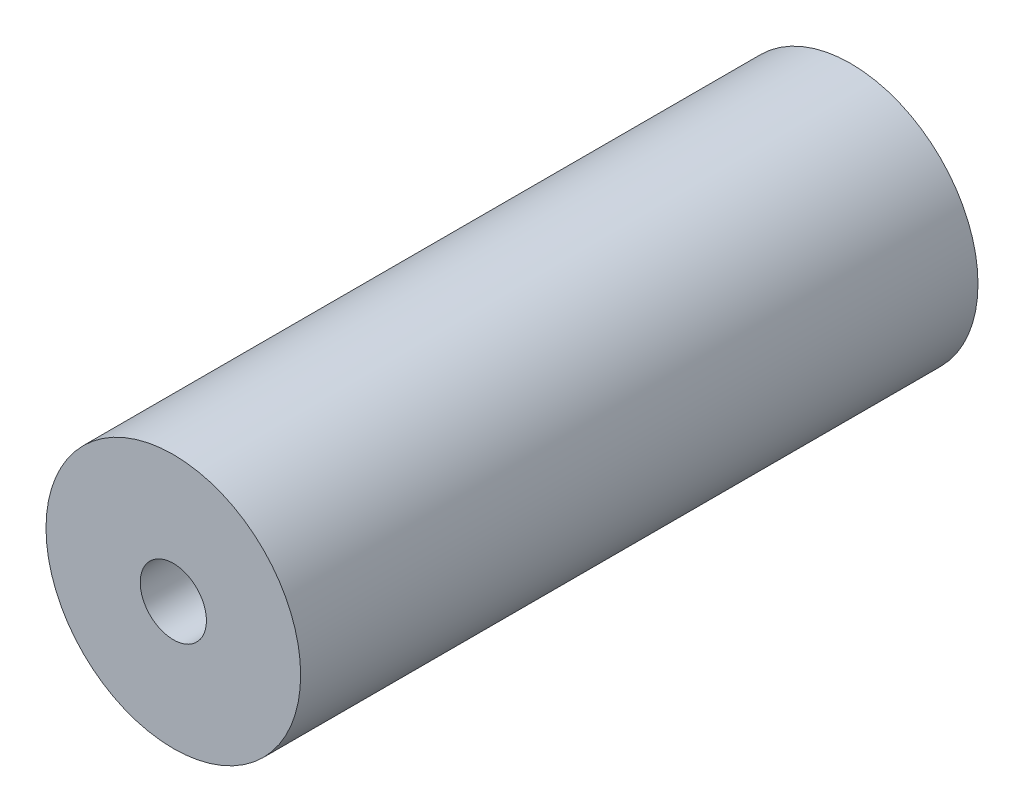
ISO-10303-21;
HEADER;
FILE_DESCRIPTION(('STEP AP214'),'2;1');
FILE_NAME('part.step','',(''),(''),'','','');
FILE_SCHEMA(('AUTOMOTIVE_DESIGN { 1 0 10303 214 1 1 1 1 }'));
ENDSEC;
DATA;
#1=APPLICATION_CONTEXT('core data for automotive mechanical design processes');
#2=APPLICATION_PROTOCOL_DEFINITION('international standard','automotive_design',2000,#1);
#3=PRODUCT_CONTEXT('',#1,'mechanical');
#4=PRODUCT('Part','Part','',(#3));
#5=PRODUCT_RELATED_PRODUCT_CATEGORY('part','',(#4));
#6=PRODUCT_DEFINITION_FORMATION('','',#4);
#7=PRODUCT_DEFINITION_CONTEXT('part definition',#1,'design');
#8=PRODUCT_DEFINITION('design','',#6,#7);
#9=PRODUCT_DEFINITION_SHAPE('','',#8);
#10=(LENGTH_UNIT() NAMED_UNIT(*) SI_UNIT(.MILLI.,.METRE.));
#11=(NAMED_UNIT(*) PLANE_ANGLE_UNIT() SI_UNIT($,.RADIAN.));
#12=(NAMED_UNIT(*) SI_UNIT($,.STERADIAN.) SOLID_ANGLE_UNIT());
#13=UNCERTAINTY_MEASURE_WITH_UNIT(LENGTH_MEASURE(1.E-05),#10,'distance_accuracy_value','');
#14=(GEOMETRIC_REPRESENTATION_CONTEXT(3) GLOBAL_UNCERTAINTY_ASSIGNED_CONTEXT((#13)) GLOBAL_UNIT_ASSIGNED_CONTEXT((#10,
#11,#12)) REPRESENTATION_CONTEXT('',''));
#15=CARTESIAN_POINT('',(0.,0.,0.));
#16=DIRECTION('',(0.,0.,1.));
#17=DIRECTION('',(1.,0.,0.));
#18=AXIS2_PLACEMENT_3D('',#15,#16,#17);
#19=CARTESIAN_POINT('',(0.,0.,26.6));
#20=DIRECTION('',(0.,0.,1.));
#21=DIRECTION('',(1.,0.,0.));
#22=AXIS2_PLACEMENT_3D('',#19,#20,#21);
#23=PLANE('',#22);
#24=CARTESIAN_POINT('',(0.,0.,26.6));
#25=DIRECTION('',(0.,0.,1.));
#26=DIRECTION('',(1.,0.,0.));
#27=AXIS2_PLACEMENT_3D('',#24,#25,#26);
#28=CIRCLE('',#27,5.);
#29=CARTESIAN_POINT('',(5.,0.,26.6));
#30=VERTEX_POINT('',#29);
#31=EDGE_CURVE('E10',#30,#30,#28,.T.);
#32=ORIENTED_EDGE('',*,*,#31,.T.);
#33=EDGE_LOOP('',(#32));
#34=FACE_BOUND('',#33,.T.);
#35=CARTESIAN_POINT('',(0.,0.,26.6));
#36=DIRECTION('',(0.,0.,1.));
#37=DIRECTION('',(1.,0.,0.));
#38=AXIS2_PLACEMENT_3D('',#35,#36,#37);
#39=CIRCLE('',#38,1.3);
#40=CARTESIAN_POINT('',(1.3,0.,26.6));
#41=VERTEX_POINT('',#40);
#42=EDGE_CURVE('E44',#41,#41,#39,.T.);
#43=ORIENTED_EDGE('',*,*,#42,.F.);
#44=EDGE_LOOP('',(#43));
#45=FACE_BOUND('',#44,.T.);
#46=ADVANCED_FACE('F33',(#34,#45),#23,.T.);
#47=CARTESIAN_POINT('',(0.,0.,0.));
#48=DIRECTION('',(0.,0.,1.));
#49=DIRECTION('',(1.,0.,0.));
#50=AXIS2_PLACEMENT_3D('',#47,#48,#49);
#51=PLANE('',#50);
#52=CARTESIAN_POINT('',(0.,0.,0.));
#53=DIRECTION('',(0.,0.,1.));
#54=DIRECTION('',(1.,0.,0.));
#55=AXIS2_PLACEMENT_3D('',#52,#53,#54);
#56=CIRCLE('',#55,5.);
#57=CARTESIAN_POINT('',(5.,0.,0.));
#58=VERTEX_POINT('',#57);
#59=EDGE_CURVE('E37',#58,#58,#56,.T.);
#60=ORIENTED_EDGE('',*,*,#59,.F.);
#61=EDGE_LOOP('',(#60));
#62=FACE_BOUND('',#61,.T.);
#63=CARTESIAN_POINT('',(0.,0.,0.));
#64=DIRECTION('',(0.,0.,1.));
#65=DIRECTION('',(1.,0.,0.));
#66=AXIS2_PLACEMENT_3D('',#63,#64,#65);
#67=CIRCLE('',#66,1.3);
#68=CARTESIAN_POINT('',(1.3,0.,0.));
#69=VERTEX_POINT('',#68);
#70=EDGE_CURVE('E46',#69,#69,#67,.T.);
#71=ORIENTED_EDGE('',*,*,#70,.T.);
#72=EDGE_LOOP('',(#71));
#73=FACE_BOUND('',#72,.T.);
#74=ADVANCED_FACE('F56',(#62,#73),#51,.F.);
#75=CARTESIAN_POINT('',(0.,0.,26.6));
#76=DIRECTION('',(0.,0.,-1.));
#77=DIRECTION('',(-1.,0.,0.));
#78=AXIS2_PLACEMENT_3D('',#75,#76,#77);
#79=CYLINDRICAL_SURFACE('',#78,5.);
#80=ORIENTED_EDGE('',*,*,#31,.F.);
#81=EDGE_LOOP('',(#80));
#82=FACE_BOUND('',#81,.T.);
#83=ORIENTED_EDGE('',*,*,#59,.T.);
#84=EDGE_LOOP('',(#83));
#85=FACE_BOUND('',#84,.T.);
#86=ADVANCED_FACE('F35',(#82,#85),#79,.T.);
#87=CARTESIAN_POINT('',(0.,0.,26.6));
#88=DIRECTION('',(0.,0.,-1.));
#89=DIRECTION('',(-1.,0.,0.));
#90=AXIS2_PLACEMENT_3D('',#87,#88,#89);
#91=CYLINDRICAL_SURFACE('',#90,1.3);
#92=ORIENTED_EDGE('',*,*,#42,.T.);
#93=EDGE_LOOP('',(#92));
#94=FACE_BOUND('',#93,.T.);
#95=ORIENTED_EDGE('',*,*,#70,.F.);
#96=EDGE_LOOP('',(#95));
#97=FACE_BOUND('',#96,.T.);
#98=ADVANCED_FACE('F52',(#94,#97),#91,.F.);
#99=CLOSED_SHELL('',(#46,#74,#86,#98));
#100=MANIFOLD_SOLID_BREP('B2',#99);
#101=ADVANCED_BREP_SHAPE_REPRESENTATION('',(#18,#100),#14);
#102=SHAPE_DEFINITION_REPRESENTATION(#9,#101);
ENDSEC;
END-ISO-10303-21;
